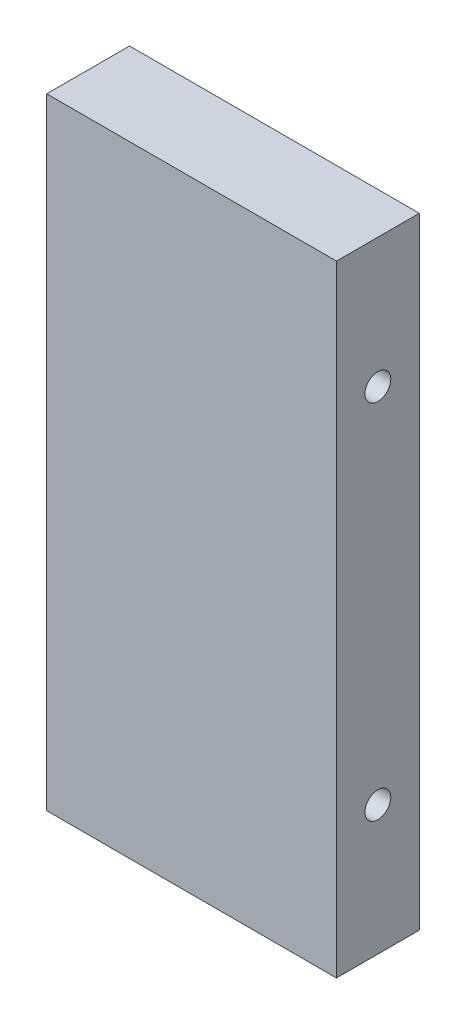
ISO-10303-21;
HEADER;
FILE_DESCRIPTION(('STEP AP214'),'2;1');
FILE_NAME('part.step','',(''),(''),'','','');
FILE_SCHEMA(('AUTOMOTIVE_DESIGN { 1 0 10303 214 1 1 1 1 }'));
ENDSEC;
DATA;
#1=APPLICATION_CONTEXT('core data for automotive mechanical design processes');
#2=APPLICATION_PROTOCOL_DEFINITION('international standard','automotive_design',2000,#1);
#3=PRODUCT_CONTEXT('',#1,'mechanical');
#4=PRODUCT('Part','Part','',(#3));
#5=PRODUCT_RELATED_PRODUCT_CATEGORY('part','',(#4));
#6=PRODUCT_DEFINITION_FORMATION('','',#4);
#7=PRODUCT_DEFINITION_CONTEXT('part definition',#1,'design');
#8=PRODUCT_DEFINITION('design','',#6,#7);
#9=PRODUCT_DEFINITION_SHAPE('','',#8);
#10=(LENGTH_UNIT() NAMED_UNIT(*) SI_UNIT(.MILLI.,.METRE.));
#11=(NAMED_UNIT(*) PLANE_ANGLE_UNIT() SI_UNIT($,.RADIAN.));
#12=(NAMED_UNIT(*) SI_UNIT($,.STERADIAN.) SOLID_ANGLE_UNIT());
#13=UNCERTAINTY_MEASURE_WITH_UNIT(LENGTH_MEASURE(1.E-05),#10,'distance_accuracy_value','');
#14=(GEOMETRIC_REPRESENTATION_CONTEXT(3) GLOBAL_UNCERTAINTY_ASSIGNED_CONTEXT((#13)) GLOBAL_UNIT_ASSIGNED_CONTEXT((#10,
#11,#12)) REPRESENTATION_CONTEXT('',''));
#15=CARTESIAN_POINT('',(0.,0.,0.));
#16=DIRECTION('',(0.,0.,1.));
#17=DIRECTION('',(1.,0.,0.));
#18=AXIS2_PLACEMENT_3D('',#15,#16,#17);
#19=CARTESIAN_POINT('',(0.,0.,8.));
#20=DIRECTION('',(1.,0.,0.));
#21=DIRECTION('',(0.,0.,-1.));
#22=AXIS2_PLACEMENT_3D('',#19,#20,#21);
#23=PLANE('',#22);
#24=CARTESIAN_POINT('',(0.,47.5,4.));
#25=DIRECTION('',(-1.,0.,0.));
#26=DIRECTION('',(0.,0.,1.));
#27=AXIS2_PLACEMENT_3D('',#24,#25,#26);
#28=CIRCLE('',#27,1.24999999999999);
#29=CARTESIAN_POINT('',(0.,47.5,5.24999999999999));
#30=VERTEX_POINT('',#29);
#31=EDGE_CURVE('E126',#30,#30,#28,.T.);
#32=ORIENTED_EDGE('',*,*,#31,.F.);
#33=EDGE_LOOP('',(#32));
#34=FACE_BOUND('',#33,.T.);
#35=CARTESIAN_POINT('',(0.,12.5,4.));
#36=DIRECTION('',(-1.,0.,0.));
#37=DIRECTION('',(0.,0.,1.));
#38=AXIS2_PLACEMENT_3D('',#35,#36,#37);
#39=CIRCLE('',#38,1.24999999999999);
#40=CARTESIAN_POINT('',(0.,12.5,5.24999999999999));
#41=VERTEX_POINT('',#40);
#42=EDGE_CURVE('E132',#41,#41,#39,.T.);
#43=ORIENTED_EDGE('',*,*,#42,.F.);
#44=EDGE_LOOP('',(#43));
#45=FACE_BOUND('',#44,.T.);
#46=DIRECTION('',(0.,-1.,0.));
#47=VECTOR('',#46,1.);
#48=CARTESIAN_POINT('',(0.,0.,0.));
#49=LINE('',#48,#47);
#50=CARTESIAN_POINT('',(0.,60.,0.));
#51=VERTEX_POINT('',#50);
#52=CARTESIAN_POINT('',(0.,0.,0.));
#53=VERTEX_POINT('',#52);
#54=EDGE_CURVE('E138',#51,#53,#49,.T.);
#55=ORIENTED_EDGE('',*,*,#54,.T.);
#56=DIRECTION('',(0.,0.,-1.));
#57=VECTOR('',#56,1.);
#58=CARTESIAN_POINT('',(0.,0.,8.));
#59=LINE('',#58,#57);
#60=CARTESIAN_POINT('',(0.,0.,8.));
#61=VERTEX_POINT('',#60);
#62=EDGE_CURVE('E11',#61,#53,#59,.T.);
#63=ORIENTED_EDGE('',*,*,#62,.F.);
#64=DIRECTION('',(0.,-1.,0.));
#65=VECTOR('',#64,1.);
#66=CARTESIAN_POINT('',(0.,0.,8.));
#67=LINE('',#66,#65);
#68=CARTESIAN_POINT('',(0.,60.,8.));
#69=VERTEX_POINT('',#68);
#70=EDGE_CURVE('E139',#69,#61,#67,.T.);
#71=ORIENTED_EDGE('',*,*,#70,.F.);
#72=DIRECTION('',(0.,0.,-1.));
#73=VECTOR('',#72,1.);
#74=CARTESIAN_POINT('',(0.,60.,8.));
#75=LINE('',#74,#73);
#76=EDGE_CURVE('E145',#69,#51,#75,.T.);
#77=ORIENTED_EDGE('',*,*,#76,.T.);
#78=EDGE_LOOP('',(#55,#63,#71,#77));
#79=FACE_BOUND('',#78,.T.);
#80=ADVANCED_FACE('F45',(#34,#45,#79),#23,.F.);
#81=CARTESIAN_POINT('',(0.,0.,8.));
#82=DIRECTION('',(0.,1.,0.));
#83=DIRECTION('',(0.,0.,1.));
#84=AXIS2_PLACEMENT_3D('',#81,#82,#83);
#85=PLANE('',#84);
#86=DIRECTION('',(1.,0.,0.));
#87=VECTOR('',#86,1.);
#88=CARTESIAN_POINT('',(0.,0.,0.));
#89=LINE('',#88,#87);
#90=CARTESIAN_POINT('',(28.,0.,0.));
#91=VERTEX_POINT('',#90);
#92=EDGE_CURVE('E148',#53,#91,#89,.T.);
#93=ORIENTED_EDGE('',*,*,#92,.T.);
#94=DIRECTION('',(0.,0.,-1.));
#95=VECTOR('',#94,1.);
#96=CARTESIAN_POINT('',(28.,0.,8.));
#97=LINE('',#96,#95);
#98=CARTESIAN_POINT('',(28.,0.,8.));
#99=VERTEX_POINT('',#98);
#100=EDGE_CURVE('E53',#99,#91,#97,.T.);
#101=ORIENTED_EDGE('',*,*,#100,.F.);
#102=DIRECTION('',(1.,0.,0.));
#103=VECTOR('',#102,1.);
#104=CARTESIAN_POINT('',(0.,0.,8.));
#105=LINE('',#104,#103);
#106=EDGE_CURVE('E92',#61,#99,#105,.T.);
#107=ORIENTED_EDGE('',*,*,#106,.F.);
#108=ORIENTED_EDGE('',*,*,#62,.T.);
#109=EDGE_LOOP('',(#93,#101,#107,#108));
#110=FACE_BOUND('',#109,.T.);
#111=ADVANCED_FACE('F172',(#110),#85,.F.);
#112=CARTESIAN_POINT('',(28.,0.,8.));
#113=DIRECTION('',(-1.,0.,0.));
#114=DIRECTION('',(0.,0.,1.));
#115=AXIS2_PLACEMENT_3D('',#112,#113,#114);
#116=PLANE('',#115);
#117=CARTESIAN_POINT('',(28.,47.5,4.));
#118=DIRECTION('',(1.,0.,0.));
#119=DIRECTION('',(0.,0.,-1.));
#120=AXIS2_PLACEMENT_3D('',#117,#118,#119);
#121=CIRCLE('',#120,1.24999999999999);
#122=CARTESIAN_POINT('',(28.,47.5,2.75000000000001));
#123=VERTEX_POINT('',#122);
#124=EDGE_CURVE('E116',#123,#123,#121,.T.);
#125=ORIENTED_EDGE('',*,*,#124,.F.);
#126=EDGE_LOOP('',(#125));
#127=FACE_BOUND('',#126,.T.);
#128=CARTESIAN_POINT('',(28.,12.5,4.));
#129=DIRECTION('',(1.,0.,0.));
#130=DIRECTION('',(0.,0.,-1.));
#131=AXIS2_PLACEMENT_3D('',#128,#129,#130);
#132=CIRCLE('',#131,1.24999999999999);
#133=CARTESIAN_POINT('',(28.,12.5,2.75000000000001));
#134=VERTEX_POINT('',#133);
#135=EDGE_CURVE('E115',#134,#134,#132,.T.);
#136=ORIENTED_EDGE('',*,*,#135,.F.);
#137=EDGE_LOOP('',(#136));
#138=FACE_BOUND('',#137,.T.);
#139=DIRECTION('',(0.,1.,0.));
#140=VECTOR('',#139,1.);
#141=CARTESIAN_POINT('',(28.,0.,0.));
#142=LINE('',#141,#140);
#143=CARTESIAN_POINT('',(28.,60.,0.));
#144=VERTEX_POINT('',#143);
#145=EDGE_CURVE('E79',#91,#144,#142,.T.);
#146=ORIENTED_EDGE('',*,*,#145,.T.);
#147=DIRECTION('',(0.,0.,-1.));
#148=VECTOR('',#147,1.);
#149=CARTESIAN_POINT('',(28.,60.,8.));
#150=LINE('',#149,#148);
#151=CARTESIAN_POINT('',(28.,60.,8.));
#152=VERTEX_POINT('',#151);
#153=EDGE_CURVE('E153',#152,#144,#150,.T.);
#154=ORIENTED_EDGE('',*,*,#153,.F.);
#155=DIRECTION('',(0.,1.,0.));
#156=VECTOR('',#155,1.);
#157=CARTESIAN_POINT('',(28.,0.,8.));
#158=LINE('',#157,#156);
#159=EDGE_CURVE('E142',#99,#152,#158,.T.);
#160=ORIENTED_EDGE('',*,*,#159,.F.);
#161=ORIENTED_EDGE('',*,*,#100,.T.);
#162=EDGE_LOOP('',(#146,#154,#160,#161));
#163=FACE_BOUND('',#162,.T.);
#164=ADVANCED_FACE('F155',(#127,#138,#163),#116,.F.);
#165=CARTESIAN_POINT('',(0.,60.,8.));
#166=DIRECTION('',(0.,-1.,0.));
#167=DIRECTION('',(0.,0.,-1.));
#168=AXIS2_PLACEMENT_3D('',#165,#166,#167);
#169=PLANE('',#168);
#170=DIRECTION('',(-1.,0.,0.));
#171=VECTOR('',#170,1.);
#172=CARTESIAN_POINT('',(0.,60.,0.));
#173=LINE('',#172,#171);
#174=EDGE_CURVE('E85',#144,#51,#173,.T.);
#175=ORIENTED_EDGE('',*,*,#174,.T.);
#176=ORIENTED_EDGE('',*,*,#76,.F.);
#177=DIRECTION('',(-1.,0.,0.));
#178=VECTOR('',#177,1.);
#179=CARTESIAN_POINT('',(0.,60.,8.));
#180=LINE('',#179,#178);
#181=EDGE_CURVE('E61',#152,#69,#180,.T.);
#182=ORIENTED_EDGE('',*,*,#181,.F.);
#183=ORIENTED_EDGE('',*,*,#153,.T.);
#184=EDGE_LOOP('',(#175,#176,#182,#183));
#185=FACE_BOUND('',#184,.T.);
#186=ADVANCED_FACE('F162',(#185),#169,.F.);
#187=CARTESIAN_POINT('',(0.,0.,8.));
#188=DIRECTION('',(0.,0.,-1.));
#189=DIRECTION('',(-1.,0.,0.));
#190=AXIS2_PLACEMENT_3D('',#187,#188,#189);
#191=PLANE('',#190);
#192=ORIENTED_EDGE('',*,*,#70,.T.);
#193=ORIENTED_EDGE('',*,*,#106,.T.);
#194=ORIENTED_EDGE('',*,*,#159,.T.);
#195=ORIENTED_EDGE('',*,*,#181,.T.);
#196=EDGE_LOOP('',(#192,#193,#194,#195));
#197=FACE_BOUND('',#196,.T.);
#198=ADVANCED_FACE('F164',(#197),#191,.F.);
#199=CARTESIAN_POINT('',(0.,0.,0.));
#200=DIRECTION('',(0.,0.,-1.));
#201=DIRECTION('',(-1.,0.,0.));
#202=AXIS2_PLACEMENT_3D('',#199,#200,#201);
#203=PLANE('',#202);
#204=ORIENTED_EDGE('',*,*,#54,.F.);
#205=ORIENTED_EDGE('',*,*,#174,.F.);
#206=ORIENTED_EDGE('',*,*,#145,.F.);
#207=ORIENTED_EDGE('',*,*,#92,.F.);
#208=EDGE_LOOP('',(#204,#205,#206,#207));
#209=FACE_BOUND('',#208,.T.);
#210=ADVANCED_FACE('F158',(#209),#203,.T.);
#211=CARTESIAN_POINT('',(7.5,12.5,4.));
#212=DIRECTION('',(-1.,0.,0.));
#213=DIRECTION('',(0.,0.,1.));
#214=AXIS2_PLACEMENT_3D('',#211,#212,#213);
#215=CONICAL_SURFACE('',#214,1.25,1.02974425867665);
#216=CARTESIAN_POINT('',(8.25107577378445,12.5,4.));
#217=VERTEX_POINT('',#216);
#218=VERTEX_LOOP('',#217);
#219=FACE_BOUND('',#218,.T.);
#220=CARTESIAN_POINT('',(7.5,12.5,4.));
#221=DIRECTION('',(-1.,0.,0.));
#222=DIRECTION('',(0.,0.,1.));
#223=AXIS2_PLACEMENT_3D('',#220,#221,#222);
#224=CIRCLE('',#223,1.25);
#225=CARTESIAN_POINT('',(7.5,12.5,5.25));
#226=VERTEX_POINT('',#225);
#227=EDGE_CURVE('E135',#226,#226,#224,.T.);
#228=ORIENTED_EDGE('',*,*,#227,.T.);
#229=EDGE_LOOP('',(#228));
#230=FACE_BOUND('',#229,.T.);
#231=ADVANCED_FACE('F187',(#219,#230),#215,.F.);
#232=CARTESIAN_POINT('',(0.,12.5,4.));
#233=DIRECTION('',(-1.,0.,0.));
#234=DIRECTION('',(0.,0.,1.));
#235=AXIS2_PLACEMENT_3D('',#232,#233,#234);
#236=CYLINDRICAL_SURFACE('',#235,1.24999999999999);
#237=ORIENTED_EDGE('',*,*,#227,.F.);
#238=EDGE_LOOP('',(#237));
#239=FACE_BOUND('',#238,.T.);
#240=ORIENTED_EDGE('',*,*,#42,.T.);
#241=EDGE_LOOP('',(#240));
#242=FACE_BOUND('',#241,.T.);
#243=ADVANCED_FACE('F185',(#239,#242),#236,.F.);
#244=CARTESIAN_POINT('',(7.5,47.5,4.));
#245=DIRECTION('',(-1.,0.,0.));
#246=DIRECTION('',(0.,0.,1.));
#247=AXIS2_PLACEMENT_3D('',#244,#245,#246);
#248=CONICAL_SURFACE('',#247,1.25,1.02974425867666);
#249=CARTESIAN_POINT('',(8.25107577378445,47.5,4.));
#250=VERTEX_POINT('',#249);
#251=VERTEX_LOOP('',#250);
#252=FACE_BOUND('',#251,.T.);
#253=CARTESIAN_POINT('',(7.5,47.5,4.));
#254=DIRECTION('',(-1.,0.,0.));
#255=DIRECTION('',(0.,0.,1.));
#256=AXIS2_PLACEMENT_3D('',#253,#254,#255);
#257=CIRCLE('',#256,1.25);
#258=CARTESIAN_POINT('',(7.5,47.5,5.25));
#259=VERTEX_POINT('',#258);
#260=EDGE_CURVE('E129',#259,#259,#257,.T.);
#261=ORIENTED_EDGE('',*,*,#260,.T.);
#262=EDGE_LOOP('',(#261));
#263=FACE_BOUND('',#262,.T.);
#264=ADVANCED_FACE('F186',(#252,#263),#248,.F.);
#265=CARTESIAN_POINT('',(0.,47.5,4.));
#266=DIRECTION('',(-1.,0.,0.));
#267=DIRECTION('',(0.,0.,1.));
#268=AXIS2_PLACEMENT_3D('',#265,#266,#267);
#269=CYLINDRICAL_SURFACE('',#268,1.24999999999999);
#270=ORIENTED_EDGE('',*,*,#260,.F.);
#271=EDGE_LOOP('',(#270));
#272=FACE_BOUND('',#271,.T.);
#273=ORIENTED_EDGE('',*,*,#31,.T.);
#274=EDGE_LOOP('',(#273));
#275=FACE_BOUND('',#274,.T.);
#276=ADVANCED_FACE('F194',(#272,#275),#269,.F.);
#277=CARTESIAN_POINT('',(20.5,12.5,4.));
#278=DIRECTION('',(1.,0.,0.));
#279=DIRECTION('',(0.,0.,-1.));
#280=AXIS2_PLACEMENT_3D('',#277,#278,#279);
#281=CONICAL_SURFACE('',#280,1.25,1.02974425867665);
#282=CARTESIAN_POINT('',(19.7489242262155,12.5,4.));
#283=VERTEX_POINT('',#282);
#284=VERTEX_LOOP('',#283);
#285=FACE_BOUND('',#284,.T.);
#286=CARTESIAN_POINT('',(20.5,12.5,4.));
#287=DIRECTION('',(1.,0.,0.));
#288=DIRECTION('',(0.,0.,-1.));
#289=AXIS2_PLACEMENT_3D('',#286,#287,#288);
#290=CIRCLE('',#289,1.25);
#291=CARTESIAN_POINT('',(20.5,12.5,2.75));
#292=VERTEX_POINT('',#291);
#293=EDGE_CURVE('E119',#292,#292,#290,.T.);
#294=ORIENTED_EDGE('',*,*,#293,.T.);
#295=EDGE_LOOP('',(#294));
#296=FACE_BOUND('',#295,.T.);
#297=ADVANCED_FACE('F244',(#285,#296),#281,.F.);
#298=CARTESIAN_POINT('',(28.,12.5,4.));
#299=DIRECTION('',(1.,0.,0.));
#300=DIRECTION('',(0.,0.,-1.));
#301=AXIS2_PLACEMENT_3D('',#298,#299,#300);
#302=CYLINDRICAL_SURFACE('',#301,1.24999999999999);
#303=ORIENTED_EDGE('',*,*,#293,.F.);
#304=EDGE_LOOP('',(#303));
#305=FACE_BOUND('',#304,.T.);
#306=ORIENTED_EDGE('',*,*,#135,.T.);
#307=EDGE_LOOP('',(#306));
#308=FACE_BOUND('',#307,.T.);
#309=ADVANCED_FACE('F109',(#305,#308),#302,.F.);
#310=CARTESIAN_POINT('',(20.5,47.5,4.));
#311=DIRECTION('',(1.,0.,0.));
#312=DIRECTION('',(0.,0.,-1.));
#313=AXIS2_PLACEMENT_3D('',#310,#311,#312);
#314=CONICAL_SURFACE('',#313,1.25,1.02974425867666);
#315=CARTESIAN_POINT('',(19.7489242262155,47.5,4.));
#316=VERTEX_POINT('',#315);
#317=VERTEX_LOOP('',#316);
#318=FACE_BOUND('',#317,.T.);
#319=CARTESIAN_POINT('',(20.5,47.5,4.));
#320=DIRECTION('',(1.,0.,0.));
#321=DIRECTION('',(0.,0.,-1.));
#322=AXIS2_PLACEMENT_3D('',#319,#320,#321);
#323=CIRCLE('',#322,1.25);
#324=CARTESIAN_POINT('',(20.5,47.5,2.75));
#325=VERTEX_POINT('',#324);
#326=EDGE_CURVE('E113',#325,#325,#323,.T.);
#327=ORIENTED_EDGE('',*,*,#326,.T.);
#328=EDGE_LOOP('',(#327));
#329=FACE_BOUND('',#328,.T.);
#330=ADVANCED_FACE('F105',(#318,#329),#314,.F.);
#331=CARTESIAN_POINT('',(28.,47.5,4.));
#332=DIRECTION('',(1.,0.,0.));
#333=DIRECTION('',(0.,0.,-1.));
#334=AXIS2_PLACEMENT_3D('',#331,#332,#333);
#335=CYLINDRICAL_SURFACE('',#334,1.24999999999999);
#336=ORIENTED_EDGE('',*,*,#326,.F.);
#337=EDGE_LOOP('',(#336));
#338=FACE_BOUND('',#337,.T.);
#339=ORIENTED_EDGE('',*,*,#124,.T.);
#340=EDGE_LOOP('',(#339));
#341=FACE_BOUND('',#340,.T.);
#342=ADVANCED_FACE('F108',(#338,#341),#335,.F.);
#343=CLOSED_SHELL('',(#80,#111,#164,#186,#198,#210,#231,#243,#264,#276,#297,#309,#330,#342));
#344=MANIFOLD_SOLID_BREP('B2',#343);
#345=ADVANCED_BREP_SHAPE_REPRESENTATION('',(#18,#344),#14);
#346=SHAPE_DEFINITION_REPRESENTATION(#9,#345);
ENDSEC;
END-ISO-10303-21;
